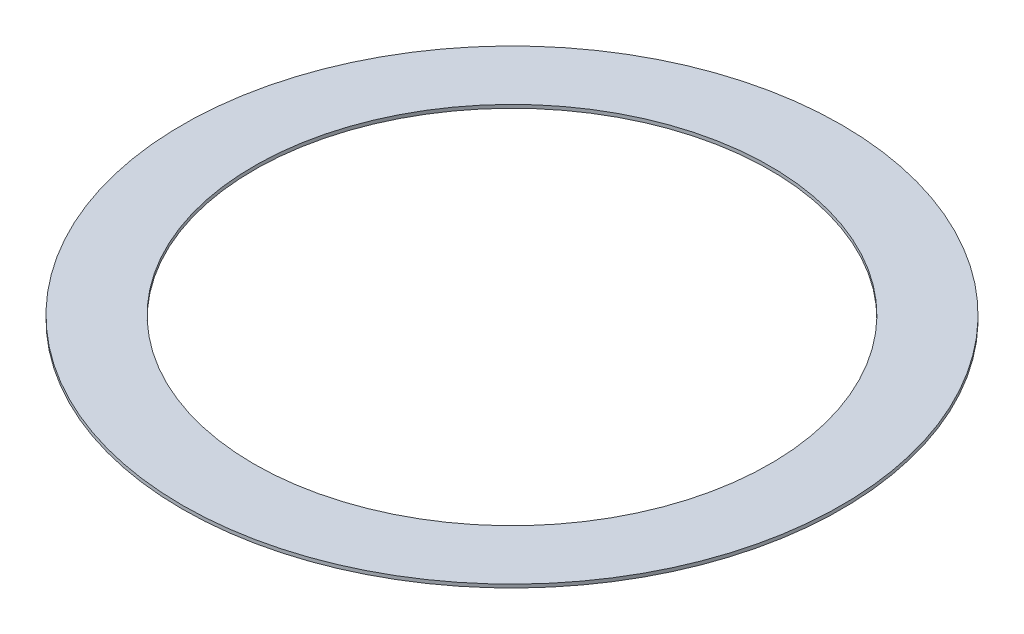
ISO-10303-21;
HEADER;
FILE_DESCRIPTION(('STEP AP214'),'2;1');
FILE_NAME('part.step','',(''),(''),'','','');
FILE_SCHEMA(('AUTOMOTIVE_DESIGN { 1 0 10303 214 1 1 1 1 }'));
ENDSEC;
DATA;
#1=APPLICATION_CONTEXT('core data for automotive mechanical design processes');
#2=APPLICATION_PROTOCOL_DEFINITION('international standard','automotive_design',2000,#1);
#3=PRODUCT_CONTEXT('',#1,'mechanical');
#4=PRODUCT('Part','Part','',(#3));
#5=PRODUCT_RELATED_PRODUCT_CATEGORY('part','',(#4));
#6=PRODUCT_DEFINITION_FORMATION('','',#4);
#7=PRODUCT_DEFINITION_CONTEXT('part definition',#1,'design');
#8=PRODUCT_DEFINITION('design','',#6,#7);
#9=PRODUCT_DEFINITION_SHAPE('','',#8);
#10=(LENGTH_UNIT() NAMED_UNIT(*) SI_UNIT(.MILLI.,.METRE.));
#11=(NAMED_UNIT(*) PLANE_ANGLE_UNIT() SI_UNIT($,.RADIAN.));
#12=(NAMED_UNIT(*) SI_UNIT($,.STERADIAN.) SOLID_ANGLE_UNIT());
#13=UNCERTAINTY_MEASURE_WITH_UNIT(LENGTH_MEASURE(1.E-05),#10,'distance_accuracy_value','');
#14=(GEOMETRIC_REPRESENTATION_CONTEXT(3) GLOBAL_UNCERTAINTY_ASSIGNED_CONTEXT((#13)) GLOBAL_UNIT_ASSIGNED_CONTEXT((#10,
#11,#12)) REPRESENTATION_CONTEXT('',''));
#15=CARTESIAN_POINT('',(0.,0.,0.));
#16=DIRECTION('',(0.,0.,1.));
#17=DIRECTION('',(1.,0.,0.));
#18=AXIS2_PLACEMENT_3D('',#15,#16,#17);
#19=CARTESIAN_POINT('',(0.,3.,0.));
#20=DIRECTION('',(0.,1.,0.));
#21=DIRECTION('',(0.,0.,1.));
#22=AXIS2_PLACEMENT_3D('',#19,#20,#21);
#23=PLANE('',#22);
#24=CARTESIAN_POINT('',(0.,3.,0.));
#25=DIRECTION('',(0.,1.,0.));
#26=DIRECTION('',(0.,0.,1.));
#27=AXIS2_PLACEMENT_3D('',#24,#25,#26);
#28=CIRCLE('',#27,292.337683561);
#29=CARTESIAN_POINT('',(0.,3.,292.337683561));
#30=VERTEX_POINT('',#29);
#31=EDGE_CURVE('E10',#30,#30,#28,.T.);
#32=ORIENTED_EDGE('',*,*,#31,.T.);
#33=EDGE_LOOP('',(#32));
#34=FACE_BOUND('',#33,.T.);
#35=CARTESIAN_POINT('',(0.,3.,0.));
#36=DIRECTION('',(0.,1.,0.));
#37=DIRECTION('',(0.,0.,1.));
#38=AXIS2_PLACEMENT_3D('',#35,#36,#37);
#39=CIRCLE('',#38,228.887635763614);
#40=CARTESIAN_POINT('',(0.,3.,228.887635763614));
#41=VERTEX_POINT('',#40);
#42=EDGE_CURVE('E42',#41,#41,#39,.T.);
#43=ORIENTED_EDGE('',*,*,#42,.F.);
#44=EDGE_LOOP('',(#43));
#45=FACE_BOUND('',#44,.T.);
#46=ADVANCED_FACE('F31',(#34,#45),#23,.T.);
#47=CARTESIAN_POINT('',(0.,0.,0.));
#48=DIRECTION('',(0.,1.,0.));
#49=DIRECTION('',(0.,0.,1.));
#50=AXIS2_PLACEMENT_3D('',#47,#48,#49);
#51=PLANE('',#50);
#52=CARTESIAN_POINT('',(0.,0.,0.));
#53=DIRECTION('',(0.,1.,0.));
#54=DIRECTION('',(0.,0.,1.));
#55=AXIS2_PLACEMENT_3D('',#52,#53,#54);
#56=CIRCLE('',#55,292.337683561);
#57=CARTESIAN_POINT('',(0.,0.,292.337683561));
#58=VERTEX_POINT('',#57);
#59=EDGE_CURVE('E35',#58,#58,#56,.T.);
#60=ORIENTED_EDGE('',*,*,#59,.F.);
#61=EDGE_LOOP('',(#60));
#62=FACE_BOUND('',#61,.T.);
#63=CARTESIAN_POINT('',(0.,0.,0.));
#64=DIRECTION('',(0.,1.,0.));
#65=DIRECTION('',(0.,0.,1.));
#66=AXIS2_PLACEMENT_3D('',#63,#64,#65);
#67=CIRCLE('',#66,228.887635763614);
#68=CARTESIAN_POINT('',(0.,0.,228.887635763614));
#69=VERTEX_POINT('',#68);
#70=EDGE_CURVE('E44',#69,#69,#67,.T.);
#71=ORIENTED_EDGE('',*,*,#70,.T.);
#72=EDGE_LOOP('',(#71));
#73=FACE_BOUND('',#72,.T.);
#74=ADVANCED_FACE('F54',(#62,#73),#51,.F.);
#75=CARTESIAN_POINT('',(0.,3.,0.));
#76=DIRECTION('',(0.,-1.,0.));
#77=DIRECTION('',(0.,0.,-1.));
#78=AXIS2_PLACEMENT_3D('',#75,#76,#77);
#79=CYLINDRICAL_SURFACE('',#78,292.337683561);
#80=ORIENTED_EDGE('',*,*,#31,.F.);
#81=EDGE_LOOP('',(#80));
#82=FACE_BOUND('',#81,.T.);
#83=ORIENTED_EDGE('',*,*,#59,.T.);
#84=EDGE_LOOP('',(#83));
#85=FACE_BOUND('',#84,.T.);
#86=ADVANCED_FACE('F33',(#82,#85),#79,.T.);
#87=CARTESIAN_POINT('',(0.,3.,0.));
#88=DIRECTION('',(0.,-1.,0.));
#89=DIRECTION('',(0.,0.,-1.));
#90=AXIS2_PLACEMENT_3D('',#87,#88,#89);
#91=CYLINDRICAL_SURFACE('',#90,228.887635763614);
#92=ORIENTED_EDGE('',*,*,#42,.T.);
#93=EDGE_LOOP('',(#92));
#94=FACE_BOUND('',#93,.T.);
#95=ORIENTED_EDGE('',*,*,#70,.F.);
#96=EDGE_LOOP('',(#95));
#97=FACE_BOUND('',#96,.T.);
#98=ADVANCED_FACE('F50',(#94,#97),#91,.F.);
#99=CLOSED_SHELL('',(#46,#74,#86,#98));
#100=MANIFOLD_SOLID_BREP('B2',#99);
#101=ADVANCED_BREP_SHAPE_REPRESENTATION('',(#18,#100),#14);
#102=SHAPE_DEFINITION_REPRESENTATION(#9,#101);
ENDSEC;
END-ISO-10303-21;
